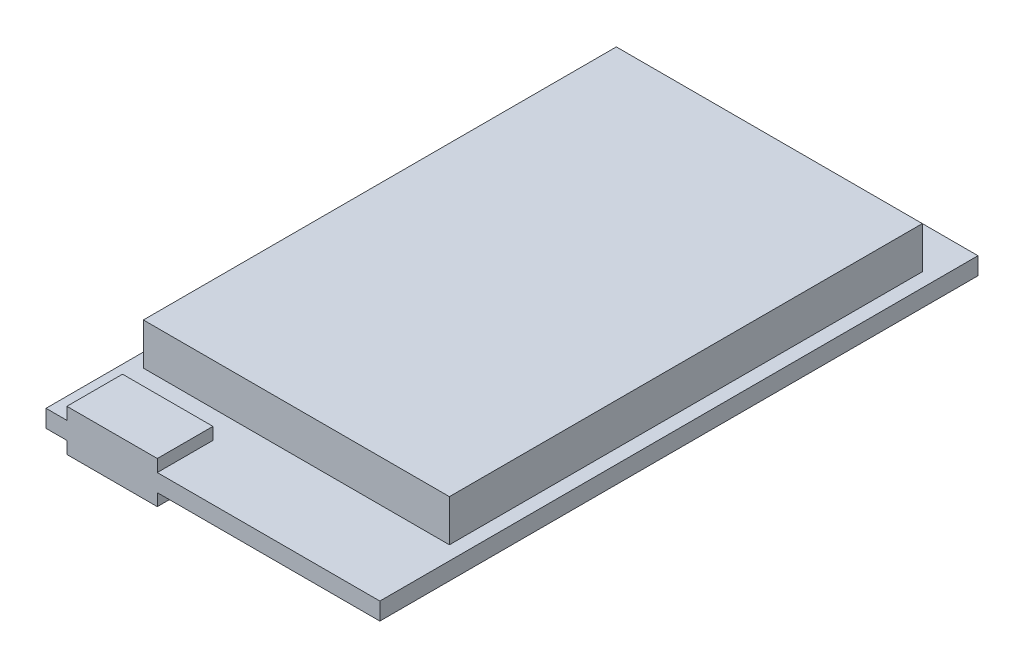
ISO-10303-21;
HEADER;
FILE_DESCRIPTION(('STEP AP214'),'2;1');
FILE_NAME('part.step','',(''),(''),'','','');
FILE_SCHEMA(('AUTOMOTIVE_DESIGN { 1 0 10303 214 1 1 1 1 }'));
ENDSEC;
DATA;
#1=APPLICATION_CONTEXT('core data for automotive mechanical design processes');
#2=APPLICATION_PROTOCOL_DEFINITION('international standard','automotive_design',2000,#1);
#3=PRODUCT_CONTEXT('',#1,'mechanical');
#4=PRODUCT('Part','Part','',(#3));
#5=PRODUCT_RELATED_PRODUCT_CATEGORY('part','',(#4));
#6=PRODUCT_DEFINITION_FORMATION('','',#4);
#7=PRODUCT_DEFINITION_CONTEXT('part definition',#1,'design');
#8=PRODUCT_DEFINITION('design','',#6,#7);
#9=PRODUCT_DEFINITION_SHAPE('','',#8);
#10=(LENGTH_UNIT() NAMED_UNIT(*) SI_UNIT(.MILLI.,.METRE.));
#11=(NAMED_UNIT(*) PLANE_ANGLE_UNIT() SI_UNIT($,.RADIAN.));
#12=(NAMED_UNIT(*) SI_UNIT($,.STERADIAN.) SOLID_ANGLE_UNIT());
#13=UNCERTAINTY_MEASURE_WITH_UNIT(LENGTH_MEASURE(1.E-05),#10,'distance_accuracy_value','');
#14=(GEOMETRIC_REPRESENTATION_CONTEXT(3) GLOBAL_UNCERTAINTY_ASSIGNED_CONTEXT((#13)) GLOBAL_UNIT_ASSIGNED_CONTEXT((#10,
#11,#12)) REPRESENTATION_CONTEXT('',''));
#15=CARTESIAN_POINT('',(0.,0.,0.));
#16=DIRECTION('',(0.,0.,1.));
#17=DIRECTION('',(1.,0.,0.));
#18=AXIS2_PLACEMENT_3D('',#15,#16,#17);
#19=CARTESIAN_POINT('',(12.,1.25,-21.5));
#20=DIRECTION('',(-1.,0.,0.));
#21=DIRECTION('',(0.,0.,1.));
#22=AXIS2_PLACEMENT_3D('',#19,#20,#21);
#23=PLANE('',#22);
#24=DIRECTION('',(0.,0.,-1.));
#25=VECTOR('',#24,1.);
#26=CARTESIAN_POINT('',(12.,0.,-21.5));
#27=LINE('',#26,#25);
#28=CARTESIAN_POINT('',(12.,0.,21.5));
#29=VERTEX_POINT('',#28);
#30=CARTESIAN_POINT('',(12.,0.,-21.5));
#31=VERTEX_POINT('',#30);
#32=EDGE_CURVE('E230',#29,#31,#27,.T.);
#33=ORIENTED_EDGE('',*,*,#32,.T.);
#34=DIRECTION('',(0.,-1.,0.));
#35=VECTOR('',#34,1.);
#36=CARTESIAN_POINT('',(12.,1.25,-21.5));
#37=LINE('',#36,#35);
#38=CARTESIAN_POINT('',(12.,1.25,-21.5));
#39=VERTEX_POINT('',#38);
#40=EDGE_CURVE('E260',#39,#31,#37,.T.);
#41=ORIENTED_EDGE('',*,*,#40,.F.);
#42=DIRECTION('',(0.,0.,-1.));
#43=VECTOR('',#42,1.);
#44=CARTESIAN_POINT('',(12.,1.25,-21.5));
#45=LINE('',#44,#43);
#46=CARTESIAN_POINT('',(12.,1.25,21.5));
#47=VERTEX_POINT('',#46);
#48=EDGE_CURVE('E231',#47,#39,#45,.T.);
#49=ORIENTED_EDGE('',*,*,#48,.F.);
#50=DIRECTION('',(0.,-1.,0.));
#51=VECTOR('',#50,1.);
#52=CARTESIAN_POINT('',(12.,1.25,21.5));
#53=LINE('',#52,#51);
#54=EDGE_CURVE('E242',#47,#29,#53,.T.);
#55=ORIENTED_EDGE('',*,*,#54,.T.);
#56=EDGE_LOOP('',(#33,#41,#49,#55));
#57=FACE_BOUND('',#56,.T.);
#58=ADVANCED_FACE('F35',(#57),#23,.F.);
#59=CARTESIAN_POINT('',(-12.,1.25,-21.5));
#60=DIRECTION('',(0.,0.,1.));
#61=DIRECTION('',(1.,0.,0.));
#62=AXIS2_PLACEMENT_3D('',#59,#60,#61);
#63=PLANE('',#62);
#64=DIRECTION('',(-1.,0.,0.));
#65=VECTOR('',#64,1.);
#66=CARTESIAN_POINT('',(-12.,0.,-21.5));
#67=LINE('',#66,#65);
#68=CARTESIAN_POINT('',(-12.,0.,-21.5));
#69=VERTEX_POINT('',#68);
#70=EDGE_CURVE('E245',#31,#69,#67,.T.);
#71=ORIENTED_EDGE('',*,*,#70,.T.);
#72=DIRECTION('',(0.,-1.,0.));
#73=VECTOR('',#72,1.);
#74=CARTESIAN_POINT('',(-12.,1.25,-21.5));
#75=LINE('',#74,#73);
#76=CARTESIAN_POINT('',(-12.,1.25,-21.5));
#77=VERTEX_POINT('',#76);
#78=EDGE_CURVE('E257',#77,#69,#75,.T.);
#79=ORIENTED_EDGE('',*,*,#78,.F.);
#80=DIRECTION('',(-1.,0.,0.));
#81=VECTOR('',#80,1.);
#82=CARTESIAN_POINT('',(-12.,1.25,-21.5));
#83=LINE('',#82,#81);
#84=EDGE_CURVE('E234',#39,#77,#83,.T.);
#85=ORIENTED_EDGE('',*,*,#84,.F.);
#86=ORIENTED_EDGE('',*,*,#40,.T.);
#87=EDGE_LOOP('',(#71,#79,#85,#86));
#88=FACE_BOUND('',#87,.T.);
#89=ADVANCED_FACE('F284',(#88),#63,.F.);
#90=CARTESIAN_POINT('',(-12.,1.25,-21.5));
#91=DIRECTION('',(1.,0.,0.));
#92=DIRECTION('',(0.,0.,-1.));
#93=AXIS2_PLACEMENT_3D('',#90,#91,#92);
#94=PLANE('',#93);
#95=DIRECTION('',(0.,0.,1.));
#96=VECTOR('',#95,1.);
#97=CARTESIAN_POINT('',(-12.,0.,-21.5));
#98=LINE('',#97,#96);
#99=CARTESIAN_POINT('',(-12.,0.,21.5));
#100=VERTEX_POINT('',#99);
#101=EDGE_CURVE('E247',#69,#100,#98,.T.);
#102=ORIENTED_EDGE('',*,*,#101,.T.);
#103=DIRECTION('',(0.,-1.,0.));
#104=VECTOR('',#103,1.);
#105=CARTESIAN_POINT('',(-12.,1.25,21.5));
#106=LINE('',#105,#104);
#107=CARTESIAN_POINT('',(-12.,1.25,21.5));
#108=VERTEX_POINT('',#107);
#109=EDGE_CURVE('E254',#108,#100,#106,.T.);
#110=ORIENTED_EDGE('',*,*,#109,.F.);
#111=DIRECTION('',(0.,0.,1.));
#112=VECTOR('',#111,1.);
#113=CARTESIAN_POINT('',(-12.,1.25,-21.5));
#114=LINE('',#113,#112);
#115=EDGE_CURVE('E237',#77,#108,#114,.T.);
#116=ORIENTED_EDGE('',*,*,#115,.F.);
#117=ORIENTED_EDGE('',*,*,#78,.T.);
#118=EDGE_LOOP('',(#102,#110,#116,#117));
#119=FACE_BOUND('',#118,.T.);
#120=ADVANCED_FACE('F279',(#119),#94,.F.);
#121=CARTESIAN_POINT('',(-12.,1.25,21.5));
#122=DIRECTION('',(0.,0.,-1.));
#123=DIRECTION('',(-1.,0.,0.));
#124=AXIS2_PLACEMENT_3D('',#121,#122,#123);
#125=PLANE('',#124);
#126=DIRECTION('',(1.,0.,0.));
#127=VECTOR('',#126,1.);
#128=CARTESIAN_POINT('',(-12.,0.,21.5));
#129=LINE('',#128,#127);
#130=CARTESIAN_POINT('',(-10.4991530492442,0.,21.5));
#131=VERTEX_POINT('',#130);
#132=EDGE_CURVE('E235',#100,#131,#129,.T.);
#133=ORIENTED_EDGE('',*,*,#132,.T.);
#134=DIRECTION('',(0.,-1.,0.));
#135=VECTOR('',#134,1.);
#136=CARTESIAN_POINT('',(-10.4991530492442,2.125,21.5));
#137=LINE('',#136,#135);
#138=CARTESIAN_POINT('',(-10.4991530492442,-0.875,21.5));
#139=VERTEX_POINT('',#138);
#140=EDGE_CURVE('E182',#131,#139,#137,.T.);
#141=ORIENTED_EDGE('',*,*,#140,.T.);
#142=DIRECTION('',(1.,0.,0.));
#143=VECTOR('',#142,1.);
#144=CARTESIAN_POINT('',(-10.4991530492442,-0.875,21.5));
#145=LINE('',#144,#143);
#146=CARTESIAN_POINT('',(-3.99915304924423,-0.875,21.5));
#147=VERTEX_POINT('',#146);
#148=EDGE_CURVE('E156',#139,#147,#145,.T.);
#149=ORIENTED_EDGE('',*,*,#148,.T.);
#150=DIRECTION('',(0.,1.,0.));
#151=VECTOR('',#150,1.);
#152=CARTESIAN_POINT('',(-3.99915304924423,2.125,21.5));
#153=LINE('',#152,#151);
#154=CARTESIAN_POINT('',(-3.99915304924423,0.,21.5));
#155=VERTEX_POINT('',#154);
#156=EDGE_CURVE('E178',#147,#155,#153,.T.);
#157=ORIENTED_EDGE('',*,*,#156,.T.);
#158=EDGE_CURVE('E249',#155,#29,#129,.T.);
#159=ORIENTED_EDGE('',*,*,#158,.T.);
#160=ORIENTED_EDGE('',*,*,#54,.F.);
#161=DIRECTION('',(1.,0.,0.));
#162=VECTOR('',#161,1.);
#163=CARTESIAN_POINT('',(-12.,1.25,21.5));
#164=LINE('',#163,#162);
#165=CARTESIAN_POINT('',(-3.99915304924423,1.25,21.5));
#166=VERTEX_POINT('',#165);
#167=EDGE_CURVE('E239',#166,#47,#164,.T.);
#168=ORIENTED_EDGE('',*,*,#167,.F.);
#169=CARTESIAN_POINT('',(-3.99915304924423,2.125,21.5));
#170=VERTEX_POINT('',#169);
#171=EDGE_CURVE('E180',#166,#170,#153,.T.);
#172=ORIENTED_EDGE('',*,*,#171,.T.);
#173=DIRECTION('',(-1.,0.,0.));
#174=VECTOR('',#173,1.);
#175=CARTESIAN_POINT('',(-10.4991530492442,2.125,21.5));
#176=LINE('',#175,#174);
#177=CARTESIAN_POINT('',(-10.4991530492442,2.125,21.5));
#178=VERTEX_POINT('',#177);
#179=EDGE_CURVE('E163',#170,#178,#176,.T.);
#180=ORIENTED_EDGE('',*,*,#179,.T.);
#181=CARTESIAN_POINT('',(-10.4991530492442,1.25,21.5));
#182=VERTEX_POINT('',#181);
#183=EDGE_CURVE('E183',#178,#182,#137,.T.);
#184=ORIENTED_EDGE('',*,*,#183,.T.);
#185=EDGE_CURVE('E240',#108,#182,#164,.T.);
#186=ORIENTED_EDGE('',*,*,#185,.F.);
#187=ORIENTED_EDGE('',*,*,#109,.T.);
#188=EDGE_LOOP('',(#133,#141,#149,#157,#159,#160,#168,#172,#180,#184,#186,#187));
#189=FACE_BOUND('',#188,.T.);
#190=ADVANCED_FACE('F274',(#189),#125,.F.);
#191=CARTESIAN_POINT('',(0.,1.25,0.));
#192=DIRECTION('',(0.,1.,0.));
#193=DIRECTION('',(0.,0.,1.));
#194=AXIS2_PLACEMENT_3D('',#191,#192,#193);
#195=PLANE('',#194);
#196=DIRECTION('',(0.,0.,-1.));
#197=VECTOR('',#196,1.);
#198=CARTESIAN_POINT('',(-3.99915304924423,1.25,0.));
#199=LINE('',#198,#197);
#200=CARTESIAN_POINT('',(-3.99915304924423,1.25,17.5));
#201=VERTEX_POINT('',#200);
#202=EDGE_CURVE('E152',#166,#201,#199,.T.);
#203=ORIENTED_EDGE('',*,*,#202,.F.);
#204=ORIENTED_EDGE('',*,*,#167,.T.);
#205=ORIENTED_EDGE('',*,*,#48,.T.);
#206=ORIENTED_EDGE('',*,*,#84,.T.);
#207=ORIENTED_EDGE('',*,*,#115,.T.);
#208=ORIENTED_EDGE('',*,*,#185,.T.);
#209=DIRECTION('',(0.,0.,1.));
#210=VECTOR('',#209,1.);
#211=CARTESIAN_POINT('',(-10.4991530492442,1.25,0.));
#212=LINE('',#211,#210);
#213=CARTESIAN_POINT('',(-10.4991530492442,1.25,17.5));
#214=VERTEX_POINT('',#213);
#215=EDGE_CURVE('E54',#214,#182,#212,.T.);
#216=ORIENTED_EDGE('',*,*,#215,.F.);
#217=DIRECTION('',(1.,0.,0.));
#218=VECTOR('',#217,1.);
#219=CARTESIAN_POINT('',(0.,1.25,17.5));
#220=LINE('',#219,#218);
#221=EDGE_CURVE('E49',#214,#201,#220,.T.);
#222=ORIENTED_EDGE('',*,*,#221,.T.);
#223=EDGE_LOOP('',(#203,#204,#205,#206,#207,#208,#216,#222));
#224=FACE_BOUND('',#223,.T.);
#225=DIRECTION('',(0.,0.,-1.));
#226=VECTOR('',#225,1.);
#227=CARTESIAN_POINT('',(11.,1.25,-18.5));
#228=LINE('',#227,#226);
#229=CARTESIAN_POINT('',(11.,1.25,15.5));
#230=VERTEX_POINT('',#229);
#231=CARTESIAN_POINT('',(11.,1.25,-18.5));
#232=VERTEX_POINT('',#231);
#233=EDGE_CURVE('E197',#230,#232,#228,.T.);
#234=ORIENTED_EDGE('',*,*,#233,.F.);
#235=DIRECTION('',(1.,0.,0.));
#236=VECTOR('',#235,1.);
#237=CARTESIAN_POINT('',(-11.,1.25,15.5));
#238=LINE('',#237,#236);
#239=CARTESIAN_POINT('',(-11.,1.25,15.5));
#240=VERTEX_POINT('',#239);
#241=EDGE_CURVE('E202',#240,#230,#238,.T.);
#242=ORIENTED_EDGE('',*,*,#241,.F.);
#243=DIRECTION('',(0.,0.,1.));
#244=VECTOR('',#243,1.);
#245=CARTESIAN_POINT('',(-11.,1.25,-18.5));
#246=LINE('',#245,#244);
#247=CARTESIAN_POINT('',(-11.,1.25,-18.5));
#248=VERTEX_POINT('',#247);
#249=EDGE_CURVE('E214',#248,#240,#246,.T.);
#250=ORIENTED_EDGE('',*,*,#249,.F.);
#251=DIRECTION('',(-1.,0.,0.));
#252=VECTOR('',#251,1.);
#253=CARTESIAN_POINT('',(-11.,1.25,-18.5));
#254=LINE('',#253,#252);
#255=EDGE_CURVE('E211',#232,#248,#254,.T.);
#256=ORIENTED_EDGE('',*,*,#255,.F.);
#257=EDGE_LOOP('',(#234,#242,#250,#256));
#258=FACE_BOUND('',#257,.T.);
#259=ADVANCED_FACE('F325',(#224,#258),#195,.T.);
#260=CARTESIAN_POINT('',(0.,0.,0.));
#261=DIRECTION('',(0.,1.,0.));
#262=DIRECTION('',(0.,0.,1.));
#263=AXIS2_PLACEMENT_3D('',#260,#261,#262);
#264=PLANE('',#263);
#265=ORIENTED_EDGE('',*,*,#158,.F.);
#266=DIRECTION('',(0.,0.,-1.));
#267=VECTOR('',#266,1.);
#268=CARTESIAN_POINT('',(-3.99915304924423,0.,0.));
#269=LINE('',#268,#267);
#270=CARTESIAN_POINT('',(-3.99915304924423,0.,17.5));
#271=VERTEX_POINT('',#270);
#272=EDGE_CURVE('E11',#155,#271,#269,.T.);
#273=ORIENTED_EDGE('',*,*,#272,.T.);
#274=DIRECTION('',(1.,0.,0.));
#275=VECTOR('',#274,1.);
#276=CARTESIAN_POINT('',(0.,0.,17.5));
#277=LINE('',#276,#275);
#278=CARTESIAN_POINT('',(-10.4991530492442,0.,17.5));
#279=VERTEX_POINT('',#278);
#280=EDGE_CURVE('E263',#279,#271,#277,.T.);
#281=ORIENTED_EDGE('',*,*,#280,.F.);
#282=DIRECTION('',(0.,0.,1.));
#283=VECTOR('',#282,1.);
#284=CARTESIAN_POINT('',(-10.4991530492442,0.,0.));
#285=LINE('',#284,#283);
#286=EDGE_CURVE('E42',#279,#131,#285,.T.);
#287=ORIENTED_EDGE('',*,*,#286,.T.);
#288=ORIENTED_EDGE('',*,*,#132,.F.);
#289=ORIENTED_EDGE('',*,*,#101,.F.);
#290=ORIENTED_EDGE('',*,*,#70,.F.);
#291=ORIENTED_EDGE('',*,*,#32,.F.);
#292=EDGE_LOOP('',(#265,#273,#281,#287,#288,#289,#290,#291));
#293=FACE_BOUND('',#292,.T.);
#294=ADVANCED_FACE('F269',(#293),#264,.F.);
#295=CARTESIAN_POINT('',(11.,4.25,-18.5));
#296=DIRECTION('',(-1.,0.,0.));
#297=DIRECTION('',(0.,0.,1.));
#298=AXIS2_PLACEMENT_3D('',#295,#296,#297);
#299=PLANE('',#298);
#300=ORIENTED_EDGE('',*,*,#233,.T.);
#301=DIRECTION('',(0.,-1.,0.));
#302=VECTOR('',#301,1.);
#303=CARTESIAN_POINT('',(11.,4.25,-18.5));
#304=LINE('',#303,#302);
#305=CARTESIAN_POINT('',(11.,4.25,-18.5));
#306=VERTEX_POINT('',#305);
#307=EDGE_CURVE('E227',#306,#232,#304,.T.);
#308=ORIENTED_EDGE('',*,*,#307,.F.);
#309=DIRECTION('',(0.,0.,-1.));
#310=VECTOR('',#309,1.);
#311=CARTESIAN_POINT('',(11.,4.25,-18.5));
#312=LINE('',#311,#310);
#313=CARTESIAN_POINT('',(11.,4.25,15.5));
#314=VERTEX_POINT('',#313);
#315=EDGE_CURVE('E198',#314,#306,#312,.T.);
#316=ORIENTED_EDGE('',*,*,#315,.F.);
#317=DIRECTION('',(0.,-1.,0.));
#318=VECTOR('',#317,1.);
#319=CARTESIAN_POINT('',(11.,4.25,15.5));
#320=LINE('',#319,#318);
#321=EDGE_CURVE('E208',#314,#230,#320,.T.);
#322=ORIENTED_EDGE('',*,*,#321,.T.);
#323=EDGE_LOOP('',(#300,#308,#316,#322));
#324=FACE_BOUND('',#323,.T.);
#325=ADVANCED_FACE('F328',(#324),#299,.F.);
#326=CARTESIAN_POINT('',(-11.,4.25,-18.5));
#327=DIRECTION('',(0.,0.,1.));
#328=DIRECTION('',(1.,0.,0.));
#329=AXIS2_PLACEMENT_3D('',#326,#327,#328);
#330=PLANE('',#329);
#331=ORIENTED_EDGE('',*,*,#255,.T.);
#332=DIRECTION('',(0.,-1.,0.));
#333=VECTOR('',#332,1.);
#334=CARTESIAN_POINT('',(-11.,4.25,-18.5));
#335=LINE('',#334,#333);
#336=CARTESIAN_POINT('',(-11.,4.25,-18.5));
#337=VERTEX_POINT('',#336);
#338=EDGE_CURVE('E224',#337,#248,#335,.T.);
#339=ORIENTED_EDGE('',*,*,#338,.F.);
#340=DIRECTION('',(-1.,0.,0.));
#341=VECTOR('',#340,1.);
#342=CARTESIAN_POINT('',(-11.,4.25,-18.5));
#343=LINE('',#342,#341);
#344=EDGE_CURVE('E201',#306,#337,#343,.T.);
#345=ORIENTED_EDGE('',*,*,#344,.F.);
#346=ORIENTED_EDGE('',*,*,#307,.T.);
#347=EDGE_LOOP('',(#331,#339,#345,#346));
#348=FACE_BOUND('',#347,.T.);
#349=ADVANCED_FACE('F333',(#348),#330,.F.);
#350=CARTESIAN_POINT('',(-11.,4.25,-18.5));
#351=DIRECTION('',(1.,0.,0.));
#352=DIRECTION('',(0.,0.,-1.));
#353=AXIS2_PLACEMENT_3D('',#350,#351,#352);
#354=PLANE('',#353);
#355=ORIENTED_EDGE('',*,*,#249,.T.);
#356=DIRECTION('',(0.,-1.,0.));
#357=VECTOR('',#356,1.);
#358=CARTESIAN_POINT('',(-11.,4.25,15.5));
#359=LINE('',#358,#357);
#360=CARTESIAN_POINT('',(-11.,4.25,15.5));
#361=VERTEX_POINT('',#360);
#362=EDGE_CURVE('E221',#361,#240,#359,.T.);
#363=ORIENTED_EDGE('',*,*,#362,.F.);
#364=DIRECTION('',(0.,0.,1.));
#365=VECTOR('',#364,1.);
#366=CARTESIAN_POINT('',(-11.,4.25,-18.5));
#367=LINE('',#366,#365);
#368=EDGE_CURVE('E204',#337,#361,#367,.T.);
#369=ORIENTED_EDGE('',*,*,#368,.F.);
#370=ORIENTED_EDGE('',*,*,#338,.T.);
#371=EDGE_LOOP('',(#355,#363,#369,#370));
#372=FACE_BOUND('',#371,.T.);
#373=ADVANCED_FACE('F337',(#372),#354,.F.);
#374=CARTESIAN_POINT('',(-11.,4.25,15.5));
#375=DIRECTION('',(0.,0.,-1.));
#376=DIRECTION('',(-1.,0.,0.));
#377=AXIS2_PLACEMENT_3D('',#374,#375,#376);
#378=PLANE('',#377);
#379=ORIENTED_EDGE('',*,*,#241,.T.);
#380=ORIENTED_EDGE('',*,*,#321,.F.);
#381=DIRECTION('',(1.,0.,0.));
#382=VECTOR('',#381,1.);
#383=CARTESIAN_POINT('',(-11.,4.25,15.5));
#384=LINE('',#383,#382);
#385=EDGE_CURVE('E206',#361,#314,#384,.T.);
#386=ORIENTED_EDGE('',*,*,#385,.F.);
#387=ORIENTED_EDGE('',*,*,#362,.T.);
#388=EDGE_LOOP('',(#379,#380,#386,#387));
#389=FACE_BOUND('',#388,.T.);
#390=ADVANCED_FACE('F341',(#389),#378,.F.);
#391=CARTESIAN_POINT('',(0.,4.25,0.));
#392=DIRECTION('',(0.,1.,0.));
#393=DIRECTION('',(0.,0.,1.));
#394=AXIS2_PLACEMENT_3D('',#391,#392,#393);
#395=PLANE('',#394);
#396=ORIENTED_EDGE('',*,*,#315,.T.);
#397=ORIENTED_EDGE('',*,*,#344,.T.);
#398=ORIENTED_EDGE('',*,*,#368,.T.);
#399=ORIENTED_EDGE('',*,*,#385,.T.);
#400=EDGE_LOOP('',(#396,#397,#398,#399));
#401=FACE_BOUND('',#400,.T.);
#402=ADVANCED_FACE('F345',(#401),#395,.T.);
#403=CARTESIAN_POINT('',(-10.4991530492442,-0.875,17.5));
#404=DIRECTION('',(0.,-1.,0.));
#405=DIRECTION('',(0.,0.,-1.));
#406=AXIS2_PLACEMENT_3D('',#403,#404,#405);
#407=PLANE('',#406);
#408=ORIENTED_EDGE('',*,*,#148,.F.);
#409=DIRECTION('',(0.,0.,1.));
#410=VECTOR('',#409,1.);
#411=CARTESIAN_POINT('',(-10.4991530492442,-0.875,17.5));
#412=LINE('',#411,#410);
#413=CARTESIAN_POINT('',(-10.4991530492442,-0.875,17.5));
#414=VERTEX_POINT('',#413);
#415=EDGE_CURVE('E190',#414,#139,#412,.T.);
#416=ORIENTED_EDGE('',*,*,#415,.F.);
#417=DIRECTION('',(1.,0.,0.));
#418=VECTOR('',#417,1.);
#419=CARTESIAN_POINT('',(-10.4991530492442,-0.875,17.5));
#420=LINE('',#419,#418);
#421=CARTESIAN_POINT('',(-3.99915304924423,-0.875,17.5));
#422=VERTEX_POINT('',#421);
#423=EDGE_CURVE('E165',#414,#422,#420,.T.);
#424=ORIENTED_EDGE('',*,*,#423,.T.);
#425=DIRECTION('',(0.,0.,1.));
#426=VECTOR('',#425,1.);
#427=CARTESIAN_POINT('',(-3.99915304924423,-0.875,17.5));
#428=LINE('',#427,#426);
#429=EDGE_CURVE('E188',#422,#147,#428,.T.);
#430=ORIENTED_EDGE('',*,*,#429,.T.);
#431=EDGE_LOOP('',(#408,#416,#424,#430));
#432=FACE_BOUND('',#431,.T.);
#433=ADVANCED_FACE('F299',(#432),#407,.T.);
#434=CARTESIAN_POINT('',(0.,0.,17.5));
#435=DIRECTION('',(0.,0.,1.));
#436=DIRECTION('',(1.,0.,0.));
#437=AXIS2_PLACEMENT_3D('',#434,#435,#436);
#438=PLANE('',#437);
#439=DIRECTION('',(0.,-1.,0.));
#440=VECTOR('',#439,1.);
#441=CARTESIAN_POINT('',(-10.4991530492442,2.125,17.5));
#442=LINE('',#441,#440);
#443=EDGE_CURVE('E171',#279,#414,#442,.T.);
#444=ORIENTED_EDGE('',*,*,#443,.F.);
#445=ORIENTED_EDGE('',*,*,#280,.T.);
#446=DIRECTION('',(0.,1.,0.));
#447=VECTOR('',#446,1.);
#448=CARTESIAN_POINT('',(-3.99915304924423,2.125,17.5));
#449=LINE('',#448,#447);
#450=EDGE_CURVE('E155',#422,#271,#449,.T.);
#451=ORIENTED_EDGE('',*,*,#450,.F.);
#452=ORIENTED_EDGE('',*,*,#423,.F.);
#453=EDGE_LOOP('',(#444,#445,#451,#452));
#454=FACE_BOUND('',#453,.T.);
#455=ADVANCED_FACE('F295',(#454),#438,.F.);
#456=CARTESIAN_POINT('',(-10.4991530492442,2.125,17.5));
#457=DIRECTION('',(-1.,0.,0.));
#458=DIRECTION('',(0.,0.,1.));
#459=AXIS2_PLACEMENT_3D('',#456,#457,#458);
#460=PLANE('',#459);
#461=ORIENTED_EDGE('',*,*,#286,.F.);
#462=ORIENTED_EDGE('',*,*,#443,.T.);
#463=ORIENTED_EDGE('',*,*,#415,.T.);
#464=ORIENTED_EDGE('',*,*,#140,.F.);
#465=EDGE_LOOP('',(#461,#462,#463,#464));
#466=FACE_BOUND('',#465,.T.);
#467=ADVANCED_FACE('F300',(#466),#460,.T.);
#468=CARTESIAN_POINT('',(-3.99915304924423,2.125,17.5));
#469=DIRECTION('',(1.,0.,0.));
#470=DIRECTION('',(0.,1.,0.));
#471=AXIS2_PLACEMENT_3D('',#468,#469,#470);
#472=PLANE('',#471);
#473=ORIENTED_EDGE('',*,*,#272,.F.);
#474=ORIENTED_EDGE('',*,*,#156,.F.);
#475=ORIENTED_EDGE('',*,*,#429,.F.);
#476=ORIENTED_EDGE('',*,*,#450,.T.);
#477=EDGE_LOOP('',(#473,#474,#475,#476));
#478=FACE_BOUND('',#477,.T.);
#479=ADVANCED_FACE('F291',(#478),#472,.T.);
#480=ORIENTED_EDGE('',*,*,#171,.F.);
#481=ORIENTED_EDGE('',*,*,#202,.T.);
#482=CARTESIAN_POINT('',(-3.99915304924423,2.125,17.5));
#483=VERTEX_POINT('',#482);
#484=EDGE_CURVE('E146',#201,#483,#449,.T.);
#485=ORIENTED_EDGE('',*,*,#484,.T.);
#486=DIRECTION('',(0.,0.,1.));
#487=VECTOR('',#486,1.);
#488=CARTESIAN_POINT('',(-3.99915304924423,2.125,17.5));
#489=LINE('',#488,#487);
#490=EDGE_CURVE('E150',#483,#170,#489,.T.);
#491=ORIENTED_EDGE('',*,*,#490,.T.);
#492=EDGE_LOOP('',(#480,#481,#485,#491));
#493=FACE_BOUND('',#492,.T.);
#494=ADVANCED_FACE('F149',(#493),#472,.T.);
#495=CARTESIAN_POINT('',(-10.4991530492442,2.125,17.5));
#496=VERTEX_POINT('',#495);
#497=EDGE_CURVE('E170',#496,#214,#442,.T.);
#498=ORIENTED_EDGE('',*,*,#497,.T.);
#499=ORIENTED_EDGE('',*,*,#215,.T.);
#500=ORIENTED_EDGE('',*,*,#183,.F.);
#501=DIRECTION('',(0.,0.,1.));
#502=VECTOR('',#501,1.);
#503=CARTESIAN_POINT('',(-10.4991530492442,2.125,17.5));
#504=LINE('',#503,#502);
#505=EDGE_CURVE('E164',#496,#178,#504,.T.);
#506=ORIENTED_EDGE('',*,*,#505,.F.);
#507=EDGE_LOOP('',(#498,#499,#500,#506));
#508=FACE_BOUND('',#507,.T.);
#509=ADVANCED_FACE('F303',(#508),#460,.T.);
#510=CARTESIAN_POINT('',(-10.4991530492442,2.125,17.5));
#511=DIRECTION('',(0.,1.,0.));
#512=DIRECTION('',(0.,0.,1.));
#513=AXIS2_PLACEMENT_3D('',#510,#511,#512);
#514=PLANE('',#513);
#515=ORIENTED_EDGE('',*,*,#179,.F.);
#516=ORIENTED_EDGE('',*,*,#490,.F.);
#517=DIRECTION('',(-1.,0.,0.));
#518=VECTOR('',#517,1.);
#519=CARTESIAN_POINT('',(-10.4991530492442,2.125,17.5));
#520=LINE('',#519,#518);
#521=EDGE_CURVE('E161',#483,#496,#520,.T.);
#522=ORIENTED_EDGE('',*,*,#521,.T.);
#523=ORIENTED_EDGE('',*,*,#505,.T.);
#524=EDGE_LOOP('',(#515,#516,#522,#523));
#525=FACE_BOUND('',#524,.T.);
#526=ADVANCED_FACE('F160',(#525),#514,.T.);
#527=ORIENTED_EDGE('',*,*,#221,.F.);
#528=ORIENTED_EDGE('',*,*,#497,.F.);
#529=ORIENTED_EDGE('',*,*,#521,.F.);
#530=ORIENTED_EDGE('',*,*,#484,.F.);
#531=EDGE_LOOP('',(#527,#528,#529,#530));
#532=FACE_BOUND('',#531,.T.);
#533=ADVANCED_FACE('F168',(#532),#438,.F.);
#534=CLOSED_SHELL('',(#58,#89,#120,#190,#259,#294,#325,#349,#373,#390,#402,#433,#455,#467,#479,
#494,#509,#526,#533));
#535=MANIFOLD_SOLID_BREP('B2',#534);
#536=ADVANCED_BREP_SHAPE_REPRESENTATION('',(#18,#535),#14);
#537=SHAPE_DEFINITION_REPRESENTATION(#9,#536);
ENDSEC;
END-ISO-10303-21;
